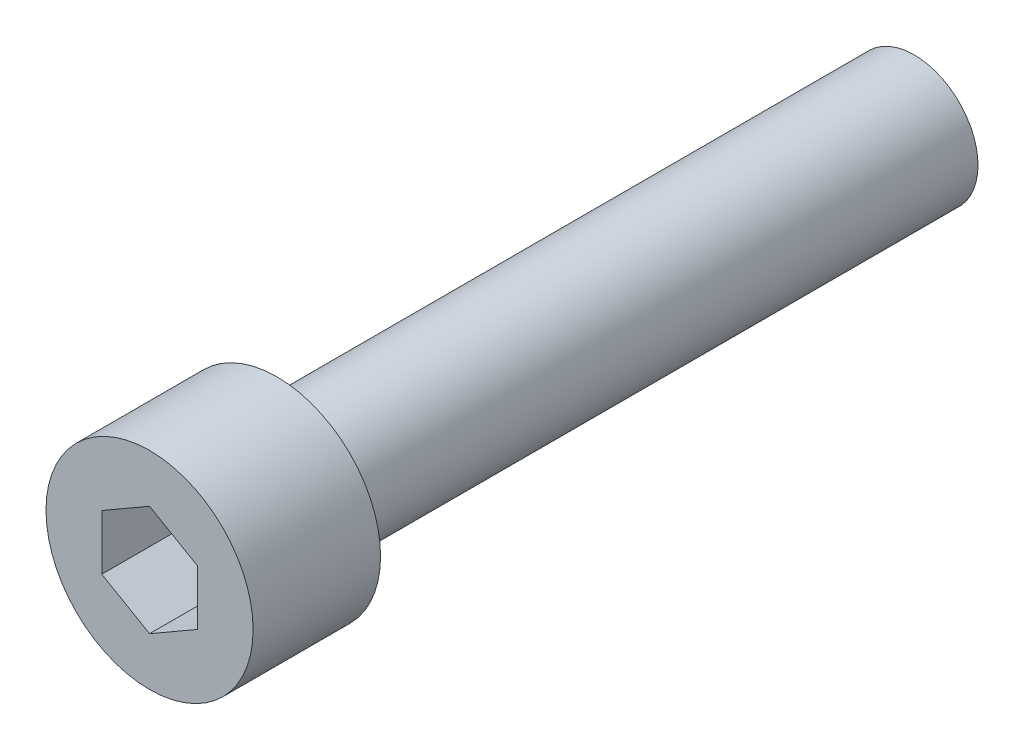
ISO-10303-21;
HEADER;
FILE_DESCRIPTION(('STEP AP214'),'2;1');
FILE_NAME('part.step','',(''),(''),'','','');
FILE_SCHEMA(('AUTOMOTIVE_DESIGN { 1 0 10303 214 1 1 1 1 }'));
ENDSEC;
DATA;
#1=APPLICATION_CONTEXT('core data for automotive mechanical design processes');
#2=APPLICATION_PROTOCOL_DEFINITION('international standard','automotive_design',2000,#1);
#3=PRODUCT_CONTEXT('',#1,'mechanical');
#4=PRODUCT('Part','Part','',(#3));
#5=PRODUCT_RELATED_PRODUCT_CATEGORY('part','',(#4));
#6=PRODUCT_DEFINITION_FORMATION('','',#4);
#7=PRODUCT_DEFINITION_CONTEXT('part definition',#1,'design');
#8=PRODUCT_DEFINITION('design','',#6,#7);
#9=PRODUCT_DEFINITION_SHAPE('','',#8);
#10=(LENGTH_UNIT() NAMED_UNIT(*) SI_UNIT(.MILLI.,.METRE.));
#11=(NAMED_UNIT(*) PLANE_ANGLE_UNIT() SI_UNIT($,.RADIAN.));
#12=(NAMED_UNIT(*) SI_UNIT($,.STERADIAN.) SOLID_ANGLE_UNIT());
#13=UNCERTAINTY_MEASURE_WITH_UNIT(LENGTH_MEASURE(1.E-05),#10,'distance_accuracy_value','');
#14=(GEOMETRIC_REPRESENTATION_CONTEXT(3) GLOBAL_UNCERTAINTY_ASSIGNED_CONTEXT((#13)) GLOBAL_UNIT_ASSIGNED_CONTEXT((#10,
#11,#12)) REPRESENTATION_CONTEXT('',''));
#15=CARTESIAN_POINT('',(0.,0.,0.));
#16=DIRECTION('',(0.,0.,1.));
#17=DIRECTION('',(1.,0.,0.));
#18=AXIS2_PLACEMENT_3D('',#15,#16,#17);
#19=CARTESIAN_POINT('',(0.,0.,0.));
#20=DIRECTION('',(0.,0.,-1.));
#21=DIRECTION('',(-1.,0.,0.));
#22=AXIS2_PLACEMENT_3D('',#19,#20,#21);
#23=PLANE('',#22);
#24=DIRECTION('',(0.866025403784439,-0.5,0.));
#25=VECTOR('',#24,1.);
#26=CARTESIAN_POINT('',(-3.,-1.73205080756888,0.));
#27=LINE('',#26,#25);
#28=CARTESIAN_POINT('',(-3.,-1.73205080756888,0.));
#29=VERTEX_POINT('',#28);
#30=CARTESIAN_POINT('',(0.,-3.46410161513776,0.));
#31=VERTEX_POINT('',#30);
#32=EDGE_CURVE('E122',#29,#31,#27,.T.);
#33=ORIENTED_EDGE('',*,*,#32,.F.);
#34=DIRECTION('',(0.,-1.,0.));
#35=VECTOR('',#34,1.);
#36=CARTESIAN_POINT('',(-3.,1.73205080756888,0.));
#37=LINE('',#36,#35);
#38=CARTESIAN_POINT('',(-3.,1.73205080756888,0.));
#39=VERTEX_POINT('',#38);
#40=EDGE_CURVE('E48',#39,#29,#37,.T.);
#41=ORIENTED_EDGE('',*,*,#40,.F.);
#42=DIRECTION('',(-0.866025403784439,-0.5,0.));
#43=VECTOR('',#42,1.);
#44=CARTESIAN_POINT('',(0.,3.46410161513776,0.));
#45=LINE('',#44,#43);
#46=CARTESIAN_POINT('',(0.,3.46410161513776,0.));
#47=VERTEX_POINT('',#46);
#48=EDGE_CURVE('E131',#47,#39,#45,.T.);
#49=ORIENTED_EDGE('',*,*,#48,.F.);
#50=DIRECTION('',(-0.866025403784439,0.5,0.));
#51=VECTOR('',#50,1.);
#52=CARTESIAN_POINT('',(3.,1.73205080756888,0.));
#53=LINE('',#52,#51);
#54=CARTESIAN_POINT('',(3.,1.73205080756888,0.));
#55=VERTEX_POINT('',#54);
#56=EDGE_CURVE('E129',#55,#47,#53,.T.);
#57=ORIENTED_EDGE('',*,*,#56,.F.);
#58=DIRECTION('',(0.,1.,0.));
#59=VECTOR('',#58,1.);
#60=CARTESIAN_POINT('',(3.,-1.73205080756888,0.));
#61=LINE('',#60,#59);
#62=CARTESIAN_POINT('',(3.,-1.73205080756888,0.));
#63=VERTEX_POINT('',#62);
#64=EDGE_CURVE('E96',#63,#55,#61,.T.);
#65=ORIENTED_EDGE('',*,*,#64,.F.);
#66=DIRECTION('',(0.866025403784439,0.5,0.));
#67=VECTOR('',#66,1.);
#68=CARTESIAN_POINT('',(0.,-3.46410161513776,0.));
#69=LINE('',#68,#67);
#70=EDGE_CURVE('E125',#31,#63,#69,.T.);
#71=ORIENTED_EDGE('',*,*,#70,.F.);
#72=EDGE_LOOP('',(#33,#41,#49,#57,#65,#71));
#73=FACE_BOUND('',#72,.T.);
#74=CARTESIAN_POINT('',(0.,0.,0.));
#75=DIRECTION('',(0.,0.,1.));
#76=DIRECTION('',(1.,0.,0.));
#77=AXIS2_PLACEMENT_3D('',#74,#75,#76);
#78=CIRCLE('',#77,6.5);
#79=CARTESIAN_POINT('',(6.5,0.,0.));
#80=VERTEX_POINT('',#79);
#81=EDGE_CURVE('E11',#80,#80,#78,.T.);
#82=ORIENTED_EDGE('',*,*,#81,.T.);
#83=EDGE_LOOP('',(#82));
#84=FACE_BOUND('',#83,.T.);
#85=ADVANCED_FACE('F34',(#73,#84),#23,.F.);
#86=CARTESIAN_POINT('',(0.,0.,0.));
#87=DIRECTION('',(0.,0.,1.));
#88=DIRECTION('',(1.,0.,0.));
#89=AXIS2_PLACEMENT_3D('',#86,#87,#88);
#90=CYLINDRICAL_SURFACE('',#89,6.5);
#91=ORIENTED_EDGE('',*,*,#81,.F.);
#92=EDGE_LOOP('',(#91));
#93=FACE_BOUND('',#92,.T.);
#94=CARTESIAN_POINT('',(0.,0.,-8.));
#95=DIRECTION('',(0.,0.,1.));
#96=DIRECTION('',(1.,0.,0.));
#97=AXIS2_PLACEMENT_3D('',#94,#95,#96);
#98=CIRCLE('',#97,6.5);
#99=CARTESIAN_POINT('',(6.5,0.,-8.));
#100=VERTEX_POINT('',#99);
#101=EDGE_CURVE('E41',#100,#100,#98,.T.);
#102=ORIENTED_EDGE('',*,*,#101,.T.);
#103=EDGE_LOOP('',(#102));
#104=FACE_BOUND('',#103,.T.);
#105=ADVANCED_FACE('F148',(#93,#104),#90,.T.);
#106=CARTESIAN_POINT('',(0.,6.5,-8.));
#107=DIRECTION('',(0.,0.,1.));
#108=DIRECTION('',(1.,0.,0.));
#109=AXIS2_PLACEMENT_3D('',#106,#107,#108);
#110=PLANE('',#109);
#111=ORIENTED_EDGE('',*,*,#101,.F.);
#112=EDGE_LOOP('',(#111));
#113=FACE_BOUND('',#112,.T.);
#114=CARTESIAN_POINT('',(0.,0.,-8.));
#115=DIRECTION('',(0.,0.,1.));
#116=DIRECTION('',(1.,0.,0.));
#117=AXIS2_PLACEMENT_3D('',#114,#115,#116);
#118=CIRCLE('',#117,4.);
#119=CARTESIAN_POINT('',(4.,0.,-8.));
#120=VERTEX_POINT('',#119);
#121=EDGE_CURVE('E143',#120,#120,#118,.T.);
#122=ORIENTED_EDGE('',*,*,#121,.T.);
#123=EDGE_LOOP('',(#122));
#124=FACE_BOUND('',#123,.T.);
#125=ADVANCED_FACE('F150',(#113,#124),#110,.F.);
#126=CARTESIAN_POINT('',(0.,0.,0.));
#127=DIRECTION('',(0.,0.,1.));
#128=DIRECTION('',(1.,0.,0.));
#129=AXIS2_PLACEMENT_3D('',#126,#127,#128);
#130=CYLINDRICAL_SURFACE('',#129,4.);
#131=ORIENTED_EDGE('',*,*,#121,.F.);
#132=EDGE_LOOP('',(#131));
#133=FACE_BOUND('',#132,.T.);
#134=CARTESIAN_POINT('',(0.,0.,-48.));
#135=DIRECTION('',(0.,0.,1.));
#136=DIRECTION('',(1.,0.,0.));
#137=AXIS2_PLACEMENT_3D('',#134,#135,#136);
#138=CIRCLE('',#137,4.);
#139=CARTESIAN_POINT('',(4.,0.,-48.));
#140=VERTEX_POINT('',#139);
#141=EDGE_CURVE('E135',#140,#140,#138,.T.);
#142=ORIENTED_EDGE('',*,*,#141,.T.);
#143=EDGE_LOOP('',(#142));
#144=FACE_BOUND('',#143,.T.);
#145=ADVANCED_FACE('F153',(#133,#144),#130,.T.);
#146=CARTESIAN_POINT('',(0.,4.,-48.));
#147=DIRECTION('',(0.,0.,1.));
#148=DIRECTION('',(1.,0.,0.));
#149=AXIS2_PLACEMENT_3D('',#146,#147,#148);
#150=PLANE('',#149);
#151=ORIENTED_EDGE('',*,*,#141,.F.);
#152=EDGE_LOOP('',(#151));
#153=FACE_BOUND('',#152,.T.);
#154=ADVANCED_FACE('F159',(#153),#150,.F.);
#155=CARTESIAN_POINT('',(-3.,1.73205080756888,-6.));
#156=DIRECTION('',(-1.,0.,0.));
#157=DIRECTION('',(0.,0.,1.));
#158=AXIS2_PLACEMENT_3D('',#155,#156,#157);
#159=PLANE('',#158);
#160=ORIENTED_EDGE('',*,*,#40,.T.);
#161=DIRECTION('',(0.,0.,1.));
#162=VECTOR('',#161,1.);
#163=CARTESIAN_POINT('',(-3.,-1.73205080756888,-6.));
#164=LINE('',#163,#162);
#165=CARTESIAN_POINT('',(-3.,-1.73205080756888,-6.));
#166=VERTEX_POINT('',#165);
#167=EDGE_CURVE('E78',#166,#29,#164,.T.);
#168=ORIENTED_EDGE('',*,*,#167,.F.);
#169=DIRECTION('',(0.,-1.,0.));
#170=VECTOR('',#169,1.);
#171=CARTESIAN_POINT('',(-3.,1.73205080756888,-6.));
#172=LINE('',#171,#170);
#173=CARTESIAN_POINT('',(-3.,1.73205080756888,-6.));
#174=VERTEX_POINT('',#173);
#175=EDGE_CURVE('E133',#174,#166,#172,.T.);
#176=ORIENTED_EDGE('',*,*,#175,.F.);
#177=DIRECTION('',(0.,0.,1.));
#178=VECTOR('',#177,1.);
#179=CARTESIAN_POINT('',(-3.,1.73205080756888,-6.));
#180=LINE('',#179,#178);
#181=EDGE_CURVE('E56',#174,#39,#180,.T.);
#182=ORIENTED_EDGE('',*,*,#181,.T.);
#183=EDGE_LOOP('',(#160,#168,#176,#182));
#184=FACE_BOUND('',#183,.T.);
#185=ADVANCED_FACE('F164',(#184),#159,.F.);
#186=CARTESIAN_POINT('',(0.,3.46410161513776,-6.));
#187=DIRECTION('',(-0.5,0.866025403784439,0.));
#188=DIRECTION('',(-0.866025403784439,-0.5,0.));
#189=AXIS2_PLACEMENT_3D('',#186,#187,#188);
#190=PLANE('',#189);
#191=ORIENTED_EDGE('',*,*,#48,.T.);
#192=ORIENTED_EDGE('',*,*,#181,.F.);
#193=DIRECTION('',(-0.866025403784439,-0.5,0.));
#194=VECTOR('',#193,1.);
#195=CARTESIAN_POINT('',(0.,3.46410161513776,-6.));
#196=LINE('',#195,#194);
#197=CARTESIAN_POINT('',(0.,3.46410161513776,-6.));
#198=VERTEX_POINT('',#197);
#199=EDGE_CURVE('E108',#198,#174,#196,.T.);
#200=ORIENTED_EDGE('',*,*,#199,.F.);
#201=DIRECTION('',(0.,0.,1.));
#202=VECTOR('',#201,1.);
#203=CARTESIAN_POINT('',(0.,3.46410161513776,-6.));
#204=LINE('',#203,#202);
#205=EDGE_CURVE('E100',#198,#47,#204,.T.);
#206=ORIENTED_EDGE('',*,*,#205,.T.);
#207=EDGE_LOOP('',(#191,#192,#200,#206));
#208=FACE_BOUND('',#207,.T.);
#209=ADVANCED_FACE('F169',(#208),#190,.F.);
#210=CARTESIAN_POINT('',(3.,1.73205080756888,-6.));
#211=DIRECTION('',(0.5,0.866025403784439,0.));
#212=DIRECTION('',(-0.866025403784439,0.5,0.));
#213=AXIS2_PLACEMENT_3D('',#210,#211,#212);
#214=PLANE('',#213);
#215=ORIENTED_EDGE('',*,*,#56,.T.);
#216=ORIENTED_EDGE('',*,*,#205,.F.);
#217=DIRECTION('',(-0.866025403784439,0.5,0.));
#218=VECTOR('',#217,1.);
#219=CARTESIAN_POINT('',(3.,1.73205080756888,-6.));
#220=LINE('',#219,#218);
#221=CARTESIAN_POINT('',(3.,1.73205080756888,-6.));
#222=VERTEX_POINT('',#221);
#223=EDGE_CURVE('E104',#222,#198,#220,.T.);
#224=ORIENTED_EDGE('',*,*,#223,.F.);
#225=DIRECTION('',(0.,0.,1.));
#226=VECTOR('',#225,1.);
#227=CARTESIAN_POINT('',(3.,1.73205080756888,-6.));
#228=LINE('',#227,#226);
#229=EDGE_CURVE('E89',#222,#55,#228,.T.);
#230=ORIENTED_EDGE('',*,*,#229,.T.);
#231=EDGE_LOOP('',(#215,#216,#224,#230));
#232=FACE_BOUND('',#231,.T.);
#233=ADVANCED_FACE('F105',(#232),#214,.F.);
#234=CARTESIAN_POINT('',(3.,-1.73205080756888,-6.));
#235=DIRECTION('',(1.,0.,0.));
#236=DIRECTION('',(0.,1.,0.));
#237=AXIS2_PLACEMENT_3D('',#234,#235,#236);
#238=PLANE('',#237);
#239=ORIENTED_EDGE('',*,*,#64,.T.);
#240=ORIENTED_EDGE('',*,*,#229,.F.);
#241=DIRECTION('',(0.,1.,0.));
#242=VECTOR('',#241,1.);
#243=CARTESIAN_POINT('',(3.,-1.73205080756888,-6.));
#244=LINE('',#243,#242);
#245=CARTESIAN_POINT('',(3.,-1.73205080756888,-6.));
#246=VERTEX_POINT('',#245);
#247=EDGE_CURVE('E93',#246,#222,#244,.T.);
#248=ORIENTED_EDGE('',*,*,#247,.F.);
#249=DIRECTION('',(0.,0.,1.));
#250=VECTOR('',#249,1.);
#251=CARTESIAN_POINT('',(3.,-1.73205080756888,-6.));
#252=LINE('',#251,#250);
#253=EDGE_CURVE('E101',#246,#63,#252,.T.);
#254=ORIENTED_EDGE('',*,*,#253,.T.);
#255=EDGE_LOOP('',(#239,#240,#248,#254));
#256=FACE_BOUND('',#255,.T.);
#257=ADVANCED_FACE('F91',(#256),#238,.F.);
#258=CARTESIAN_POINT('',(0.,-3.46410161513776,-6.));
#259=DIRECTION('',(0.5,-0.866025403784438,0.));
#260=DIRECTION('',(0.866025403784439,0.5,0.));
#261=AXIS2_PLACEMENT_3D('',#258,#259,#260);
#262=PLANE('',#261);
#263=ORIENTED_EDGE('',*,*,#70,.T.);
#264=ORIENTED_EDGE('',*,*,#253,.F.);
#265=DIRECTION('',(0.866025403784439,0.5,0.));
#266=VECTOR('',#265,1.);
#267=CARTESIAN_POINT('',(0.,-3.46410161513776,-6.));
#268=LINE('',#267,#266);
#269=CARTESIAN_POINT('',(0.,-3.46410161513776,-6.));
#270=VERTEX_POINT('',#269);
#271=EDGE_CURVE('E114',#270,#246,#268,.T.);
#272=ORIENTED_EDGE('',*,*,#271,.F.);
#273=DIRECTION('',(0.,0.,1.));
#274=VECTOR('',#273,1.);
#275=CARTESIAN_POINT('',(0.,-3.46410161513776,-6.));
#276=LINE('',#275,#274);
#277=EDGE_CURVE('E138',#270,#31,#276,.T.);
#278=ORIENTED_EDGE('',*,*,#277,.T.);
#279=EDGE_LOOP('',(#263,#264,#272,#278));
#280=FACE_BOUND('',#279,.T.);
#281=ADVANCED_FACE('F195',(#280),#262,.F.);
#282=CARTESIAN_POINT('',(-3.,-1.73205080756888,-6.));
#283=DIRECTION('',(-0.5,-0.866025403784438,0.));
#284=DIRECTION('',(0.866025403784439,-0.5,0.));
#285=AXIS2_PLACEMENT_3D('',#282,#283,#284);
#286=PLANE('',#285);
#287=ORIENTED_EDGE('',*,*,#32,.T.);
#288=ORIENTED_EDGE('',*,*,#277,.F.);
#289=DIRECTION('',(0.866025403784439,-0.5,0.));
#290=VECTOR('',#289,1.);
#291=CARTESIAN_POINT('',(-3.,-1.73205080756888,-6.));
#292=LINE('',#291,#290);
#293=EDGE_CURVE('E116',#166,#270,#292,.T.);
#294=ORIENTED_EDGE('',*,*,#293,.F.);
#295=ORIENTED_EDGE('',*,*,#167,.T.);
#296=EDGE_LOOP('',(#287,#288,#294,#295));
#297=FACE_BOUND('',#296,.T.);
#298=ADVANCED_FACE('F183',(#297),#286,.F.);
#299=CARTESIAN_POINT('',(0.,0.,-6.));
#300=DIRECTION('',(0.,0.,1.));
#301=DIRECTION('',(1.,0.,0.));
#302=AXIS2_PLACEMENT_3D('',#299,#300,#301);
#303=PLANE('',#302);
#304=ORIENTED_EDGE('',*,*,#175,.T.);
#305=ORIENTED_EDGE('',*,*,#293,.T.);
#306=ORIENTED_EDGE('',*,*,#271,.T.);
#307=ORIENTED_EDGE('',*,*,#247,.T.);
#308=ORIENTED_EDGE('',*,*,#223,.T.);
#309=ORIENTED_EDGE('',*,*,#199,.T.);
#310=EDGE_LOOP('',(#304,#305,#306,#307,#308,#309));
#311=FACE_BOUND('',#310,.T.);
#312=ADVANCED_FACE('F111',(#311),#303,.T.);
#313=CLOSED_SHELL('',(#85,#105,#125,#145,#154,#185,#209,#233,#257,#281,#298,#312));
#314=MANIFOLD_SOLID_BREP('B2',#313);
#315=ADVANCED_BREP_SHAPE_REPRESENTATION('',(#18,#314),#14);
#316=SHAPE_DEFINITION_REPRESENTATION(#9,#315);
ENDSEC;
END-ISO-10303-21;
